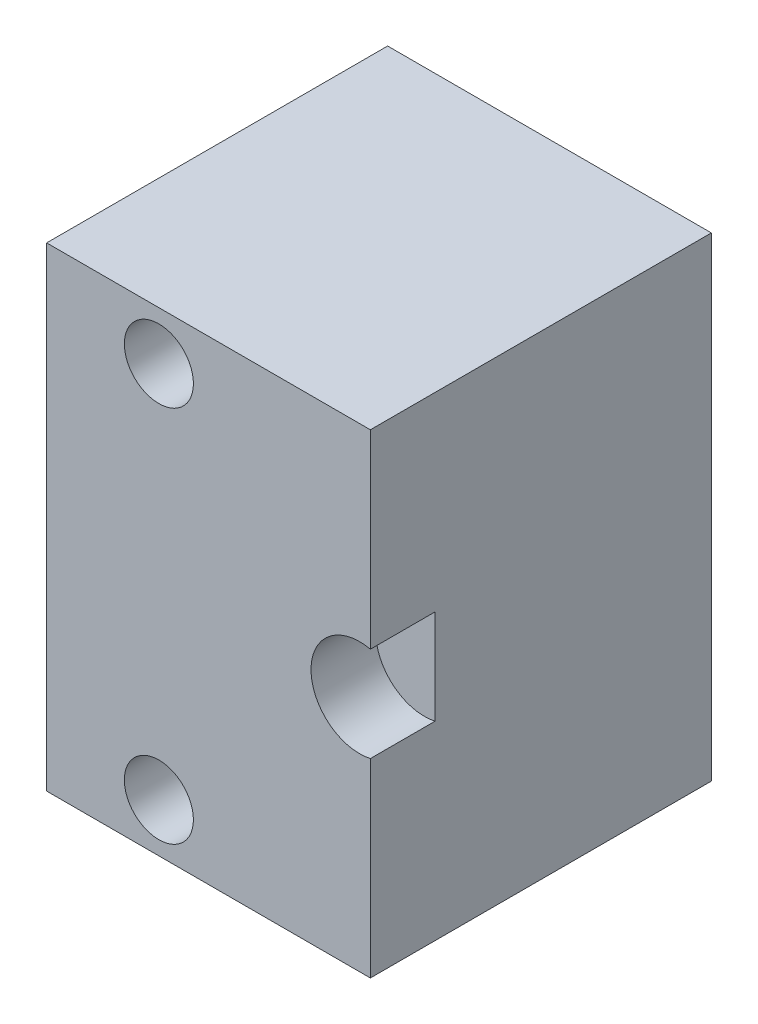
ISO-10303-21;
HEADER;
FILE_DESCRIPTION(('STEP AP214'),'2;1');
FILE_NAME('part.step','',(''),(''),'','','');
FILE_SCHEMA(('AUTOMOTIVE_DESIGN { 1 0 10303 214 1 1 1 1 }'));
ENDSEC;
DATA;
#1=APPLICATION_CONTEXT('core data for automotive mechanical design processes');
#2=APPLICATION_PROTOCOL_DEFINITION('international standard','automotive_design',2000,#1);
#3=PRODUCT_CONTEXT('',#1,'mechanical');
#4=PRODUCT('Part','Part','',(#3));
#5=PRODUCT_RELATED_PRODUCT_CATEGORY('part','',(#4));
#6=PRODUCT_DEFINITION_FORMATION('','',#4);
#7=PRODUCT_DEFINITION_CONTEXT('part definition',#1,'design');
#8=PRODUCT_DEFINITION('design','',#6,#7);
#9=PRODUCT_DEFINITION_SHAPE('','',#8);
#10=(LENGTH_UNIT() NAMED_UNIT(*) SI_UNIT(.MILLI.,.METRE.));
#11=(NAMED_UNIT(*) PLANE_ANGLE_UNIT() SI_UNIT($,.RADIAN.));
#12=(NAMED_UNIT(*) SI_UNIT($,.STERADIAN.) SOLID_ANGLE_UNIT());
#13=UNCERTAINTY_MEASURE_WITH_UNIT(LENGTH_MEASURE(1.E-05),#10,'distance_accuracy_value','');
#14=(GEOMETRIC_REPRESENTATION_CONTEXT(3) GLOBAL_UNCERTAINTY_ASSIGNED_CONTEXT((#13)) GLOBAL_UNIT_ASSIGNED_CONTEXT((#10,
#11,#12)) REPRESENTATION_CONTEXT('',''));
#15=CARTESIAN_POINT('',(0.,0.,0.));
#16=DIRECTION('',(0.,0.,1.));
#17=DIRECTION('',(1.,0.,0.));
#18=AXIS2_PLACEMENT_3D('',#15,#16,#17);
#19=CARTESIAN_POINT('',(0.,0.,15.8));
#20=DIRECTION('',(0.,0.,1.));
#21=DIRECTION('',(1.,0.,0.));
#22=AXIS2_PLACEMENT_3D('',#19,#20,#21);
#23=PLANE('',#22);
#24=CARTESIAN_POINT('',(14.5,11.,15.8));
#25=DIRECTION('',(0.,0.,1.));
#26=DIRECTION('',(1.,0.,0.));
#27=AXIS2_PLACEMENT_3D('',#24,#25,#26);
#28=CIRCLE('',#27,2.25);
#29=CARTESIAN_POINT('',(15.,13.193741096848,15.8));
#30=VERTEX_POINT('',#29);
#31=CARTESIAN_POINT('',(15.,8.80625890315197,15.8));
#32=VERTEX_POINT('',#31);
#33=EDGE_CURVE('E98',#30,#32,#28,.T.);
#34=ORIENTED_EDGE('',*,*,#33,.F.);
#35=DIRECTION('',(0.,1.,0.));
#36=VECTOR('',#35,1.);
#37=CARTESIAN_POINT('',(15.,22.,15.8));
#38=LINE('',#37,#36);
#39=CARTESIAN_POINT('',(15.,22.,15.8));
#40=VERTEX_POINT('',#39);
#41=EDGE_CURVE('E86',#30,#40,#38,.T.);
#42=ORIENTED_EDGE('',*,*,#41,.T.);
#43=DIRECTION('',(-1.,0.,0.));
#44=VECTOR('',#43,1.);
#45=CARTESIAN_POINT('',(0.,22.,15.8));
#46=LINE('',#45,#44);
#47=CARTESIAN_POINT('',(0.,22.,15.8));
#48=VERTEX_POINT('',#47);
#49=EDGE_CURVE('E111',#40,#48,#46,.T.);
#50=ORIENTED_EDGE('',*,*,#49,.T.);
#51=DIRECTION('',(0.,-1.,0.));
#52=VECTOR('',#51,1.);
#53=CARTESIAN_POINT('',(0.,22.,15.8));
#54=LINE('',#53,#52);
#55=CARTESIAN_POINT('',(0.,0.,15.8));
#56=VERTEX_POINT('',#55);
#57=EDGE_CURVE('E119',#48,#56,#54,.T.);
#58=ORIENTED_EDGE('',*,*,#57,.T.);
#59=DIRECTION('',(1.,0.,0.));
#60=VECTOR('',#59,1.);
#61=CARTESIAN_POINT('',(0.,0.,15.8));
#62=LINE('',#61,#60);
#63=CARTESIAN_POINT('',(15.,0.,15.8));
#64=VERTEX_POINT('',#63);
#65=EDGE_CURVE('E58',#56,#64,#62,.T.);
#66=ORIENTED_EDGE('',*,*,#65,.T.);
#67=EDGE_CURVE('E104',#64,#32,#38,.T.);
#68=ORIENTED_EDGE('',*,*,#67,.T.);
#69=EDGE_LOOP('',(#34,#42,#50,#58,#66,#68));
#70=FACE_BOUND('',#69,.T.);
#71=CARTESIAN_POINT('',(5.2,19.75,15.8));
#72=DIRECTION('',(0.,0.,1.));
#73=DIRECTION('',(1.,0.,0.));
#74=AXIS2_PLACEMENT_3D('',#71,#72,#73);
#75=CIRCLE('',#74,1.6);
#76=CARTESIAN_POINT('',(6.8,19.75,15.8));
#77=VERTEX_POINT('',#76);
#78=EDGE_CURVE('E126',#77,#77,#75,.T.);
#79=ORIENTED_EDGE('',*,*,#78,.F.);
#80=EDGE_LOOP('',(#79));
#81=FACE_BOUND('',#80,.T.);
#82=CARTESIAN_POINT('',(5.2,2.25,15.8));
#83=DIRECTION('',(0.,0.,1.));
#84=DIRECTION('',(1.,0.,0.));
#85=AXIS2_PLACEMENT_3D('',#82,#83,#84);
#86=CIRCLE('',#85,1.6);
#87=CARTESIAN_POINT('',(6.8,2.25,15.8));
#88=VERTEX_POINT('',#87);
#89=EDGE_CURVE('E235',#88,#88,#86,.T.);
#90=ORIENTED_EDGE('',*,*,#89,.F.);
#91=EDGE_LOOP('',(#90));
#92=FACE_BOUND('',#91,.T.);
#93=ADVANCED_FACE('F35',(#70,#81,#92),#23,.T.);
#94=CARTESIAN_POINT('',(0.,0.,0.));
#95=DIRECTION('',(0.,0.,1.));
#96=DIRECTION('',(1.,0.,0.));
#97=AXIS2_PLACEMENT_3D('',#94,#95,#96);
#98=PLANE('',#97);
#99=DIRECTION('',(0.,1.,0.));
#100=VECTOR('',#99,1.);
#101=CARTESIAN_POINT('',(15.,22.,0.));
#102=LINE('',#101,#100);
#103=CARTESIAN_POINT('',(15.,0.,0.));
#104=VERTEX_POINT('',#103);
#105=CARTESIAN_POINT('',(15.,22.,0.));
#106=VERTEX_POINT('',#105);
#107=EDGE_CURVE('E123',#104,#106,#102,.T.);
#108=ORIENTED_EDGE('',*,*,#107,.F.);
#109=DIRECTION('',(1.,0.,0.));
#110=VECTOR('',#109,1.);
#111=CARTESIAN_POINT('',(0.,0.,0.));
#112=LINE('',#111,#110);
#113=CARTESIAN_POINT('',(0.,0.,0.));
#114=VERTEX_POINT('',#113);
#115=EDGE_CURVE('E79',#114,#104,#112,.T.);
#116=ORIENTED_EDGE('',*,*,#115,.F.);
#117=DIRECTION('',(0.,-1.,0.));
#118=VECTOR('',#117,1.);
#119=CARTESIAN_POINT('',(0.,22.,0.));
#120=LINE('',#119,#118);
#121=CARTESIAN_POINT('',(0.,22.,0.));
#122=VERTEX_POINT('',#121);
#123=EDGE_CURVE('E112',#122,#114,#120,.T.);
#124=ORIENTED_EDGE('',*,*,#123,.F.);
#125=DIRECTION('',(-1.,0.,0.));
#126=VECTOR('',#125,1.);
#127=CARTESIAN_POINT('',(0.,22.,0.));
#128=LINE('',#127,#126);
#129=EDGE_CURVE('E125',#106,#122,#128,.T.);
#130=ORIENTED_EDGE('',*,*,#129,.F.);
#131=EDGE_LOOP('',(#108,#116,#124,#130));
#132=FACE_BOUND('',#131,.T.);
#133=CARTESIAN_POINT('',(5.2,19.75,0.));
#134=DIRECTION('',(0.,0.,1.));
#135=DIRECTION('',(1.,0.,0.));
#136=AXIS2_PLACEMENT_3D('',#133,#134,#135);
#137=CIRCLE('',#136,1.6);
#138=CARTESIAN_POINT('',(6.8,19.75,0.));
#139=VERTEX_POINT('',#138);
#140=EDGE_CURVE('E116',#139,#139,#137,.T.);
#141=ORIENTED_EDGE('',*,*,#140,.T.);
#142=EDGE_LOOP('',(#141));
#143=FACE_BOUND('',#142,.T.);
#144=CARTESIAN_POINT('',(5.2,2.25,0.));
#145=DIRECTION('',(0.,0.,1.));
#146=DIRECTION('',(1.,0.,0.));
#147=AXIS2_PLACEMENT_3D('',#144,#145,#146);
#148=CIRCLE('',#147,1.6);
#149=CARTESIAN_POINT('',(6.8,2.25,0.));
#150=VERTEX_POINT('',#149);
#151=EDGE_CURVE('E238',#150,#150,#148,.T.);
#152=ORIENTED_EDGE('',*,*,#151,.T.);
#153=EDGE_LOOP('',(#152));
#154=FACE_BOUND('',#153,.T.);
#155=ADVANCED_FACE('F139',(#132,#143,#154),#98,.F.);
#156=CARTESIAN_POINT('',(15.,22.,15.8));
#157=DIRECTION('',(-1.,0.,0.));
#158=DIRECTION('',(0.,0.,1.));
#159=AXIS2_PLACEMENT_3D('',#156,#157,#158);
#160=PLANE('',#159);
#161=DIRECTION('',(0.,1.,0.));
#162=VECTOR('',#161,1.);
#163=CARTESIAN_POINT('',(15.,22.,12.8));
#164=LINE('',#163,#162);
#165=CARTESIAN_POINT('',(15.,8.80625890315197,12.8));
#166=VERTEX_POINT('',#165);
#167=CARTESIAN_POINT('',(15.,13.193741096848,12.8));
#168=VERTEX_POINT('',#167);
#169=EDGE_CURVE('E101',#166,#168,#164,.T.);
#170=ORIENTED_EDGE('',*,*,#169,.F.);
#171=DIRECTION('',(0.,0.,1.));
#172=VECTOR('',#171,1.);
#173=CARTESIAN_POINT('',(15.,8.80625890315197,12.8));
#174=LINE('',#173,#172);
#175=EDGE_CURVE('E11',#166,#32,#174,.T.);
#176=ORIENTED_EDGE('',*,*,#175,.T.);
#177=ORIENTED_EDGE('',*,*,#67,.F.);
#178=DIRECTION('',(0.,0.,-1.));
#179=VECTOR('',#178,1.);
#180=CARTESIAN_POINT('',(15.,0.,15.8));
#181=LINE('',#180,#179);
#182=EDGE_CURVE('E122',#64,#104,#181,.T.);
#183=ORIENTED_EDGE('',*,*,#182,.T.);
#184=ORIENTED_EDGE('',*,*,#107,.T.);
#185=DIRECTION('',(0.,0.,-1.));
#186=VECTOR('',#185,1.);
#187=CARTESIAN_POINT('',(15.,22.,15.8));
#188=LINE('',#187,#186);
#189=EDGE_CURVE('E109',#40,#106,#188,.T.);
#190=ORIENTED_EDGE('',*,*,#189,.F.);
#191=ORIENTED_EDGE('',*,*,#41,.F.);
#192=DIRECTION('',(0.,0.,1.));
#193=VECTOR('',#192,1.);
#194=CARTESIAN_POINT('',(15.,13.193741096848,12.8));
#195=LINE('',#194,#193);
#196=EDGE_CURVE('E43',#30,#168,#195,.F.);
#197=ORIENTED_EDGE('',*,*,#196,.T.);
#198=EDGE_LOOP('',(#170,#176,#177,#183,#184,#190,#191,#197));
#199=FACE_BOUND('',#198,.T.);
#200=ADVANCED_FACE('F37',(#199),#160,.F.);
#201=CARTESIAN_POINT('',(0.,22.,15.8));
#202=DIRECTION('',(0.,-1.,0.));
#203=DIRECTION('',(0.,0.,-1.));
#204=AXIS2_PLACEMENT_3D('',#201,#202,#203);
#205=PLANE('',#204);
#206=ORIENTED_EDGE('',*,*,#129,.T.);
#207=DIRECTION('',(0.,0.,-1.));
#208=VECTOR('',#207,1.);
#209=CARTESIAN_POINT('',(0.,22.,15.8));
#210=LINE('',#209,#208);
#211=EDGE_CURVE('E132',#48,#122,#210,.T.);
#212=ORIENTED_EDGE('',*,*,#211,.F.);
#213=ORIENTED_EDGE('',*,*,#49,.F.);
#214=ORIENTED_EDGE('',*,*,#189,.T.);
#215=EDGE_LOOP('',(#206,#212,#213,#214));
#216=FACE_BOUND('',#215,.T.);
#217=ADVANCED_FACE('F144',(#216),#205,.F.);
#218=CARTESIAN_POINT('',(0.,22.,15.8));
#219=DIRECTION('',(1.,0.,0.));
#220=DIRECTION('',(0.,1.,0.));
#221=AXIS2_PLACEMENT_3D('',#218,#219,#220);
#222=PLANE('',#221);
#223=ORIENTED_EDGE('',*,*,#123,.T.);
#224=DIRECTION('',(0.,0.,-1.));
#225=VECTOR('',#224,1.);
#226=CARTESIAN_POINT('',(0.,0.,15.8));
#227=LINE('',#226,#225);
#228=EDGE_CURVE('E130',#56,#114,#227,.T.);
#229=ORIENTED_EDGE('',*,*,#228,.F.);
#230=ORIENTED_EDGE('',*,*,#57,.F.);
#231=ORIENTED_EDGE('',*,*,#211,.T.);
#232=EDGE_LOOP('',(#223,#229,#230,#231));
#233=FACE_BOUND('',#232,.T.);
#234=ADVANCED_FACE('F148',(#233),#222,.F.);
#235=CARTESIAN_POINT('',(0.,0.,15.8));
#236=DIRECTION('',(0.,1.,0.));
#237=DIRECTION('',(0.,0.,1.));
#238=AXIS2_PLACEMENT_3D('',#235,#236,#237);
#239=PLANE('',#238);
#240=ORIENTED_EDGE('',*,*,#115,.T.);
#241=ORIENTED_EDGE('',*,*,#182,.F.);
#242=ORIENTED_EDGE('',*,*,#65,.F.);
#243=ORIENTED_EDGE('',*,*,#228,.T.);
#244=EDGE_LOOP('',(#240,#241,#242,#243));
#245=FACE_BOUND('',#244,.T.);
#246=ADVANCED_FACE('F149',(#245),#239,.F.);
#247=CARTESIAN_POINT('',(5.2,19.75,15.8));
#248=DIRECTION('',(0.,0.,-1.));
#249=DIRECTION('',(-1.,0.,0.));
#250=AXIS2_PLACEMENT_3D('',#247,#248,#249);
#251=CYLINDRICAL_SURFACE('',#250,1.6);
#252=ORIENTED_EDGE('',*,*,#78,.T.);
#253=EDGE_LOOP('',(#252));
#254=FACE_BOUND('',#253,.T.);
#255=ORIENTED_EDGE('',*,*,#140,.F.);
#256=EDGE_LOOP('',(#255));
#257=FACE_BOUND('',#256,.T.);
#258=ADVANCED_FACE('F151',(#254,#257),#251,.F.);
#259=CARTESIAN_POINT('',(5.2,2.25,15.8));
#260=DIRECTION('',(0.,0.,-1.));
#261=DIRECTION('',(-1.,0.,0.));
#262=AXIS2_PLACEMENT_3D('',#259,#260,#261);
#263=CYLINDRICAL_SURFACE('',#262,1.6);
#264=ORIENTED_EDGE('',*,*,#89,.T.);
#265=EDGE_LOOP('',(#264));
#266=FACE_BOUND('',#265,.T.);
#267=ORIENTED_EDGE('',*,*,#151,.F.);
#268=EDGE_LOOP('',(#267));
#269=FACE_BOUND('',#268,.T.);
#270=ADVANCED_FACE('F157',(#266,#269),#263,.F.);
#271=CARTESIAN_POINT('',(14.5,11.,12.8));
#272=DIRECTION('',(0.,0.,1.));
#273=DIRECTION('',(1.,0.,0.));
#274=AXIS2_PLACEMENT_3D('',#271,#272,#273);
#275=CYLINDRICAL_SURFACE('',#274,2.25);
#276=CARTESIAN_POINT('',(14.5,11.,12.8));
#277=DIRECTION('',(0.,0.,1.));
#278=DIRECTION('',(1.,0.,0.));
#279=AXIS2_PLACEMENT_3D('',#276,#277,#278);
#280=CIRCLE('',#279,2.25);
#281=EDGE_CURVE('E49',#168,#166,#280,.T.);
#282=ORIENTED_EDGE('',*,*,#281,.F.);
#283=ORIENTED_EDGE('',*,*,#196,.F.);
#284=ORIENTED_EDGE('',*,*,#33,.T.);
#285=ORIENTED_EDGE('',*,*,#175,.F.);
#286=EDGE_LOOP('',(#282,#283,#284,#285));
#287=FACE_BOUND('',#286,.T.);
#288=ADVANCED_FACE('F97',(#287),#275,.F.);
#289=CARTESIAN_POINT('',(14.5,11.,12.8));
#290=DIRECTION('',(0.,0.,1.));
#291=DIRECTION('',(1.,0.,0.));
#292=AXIS2_PLACEMENT_3D('',#289,#290,#291);
#293=PLANE('',#292);
#294=ORIENTED_EDGE('',*,*,#169,.T.);
#295=ORIENTED_EDGE('',*,*,#281,.T.);
#296=EDGE_LOOP('',(#294,#295));
#297=FACE_BOUND('',#296,.T.);
#298=ADVANCED_FACE('F136',(#297),#293,.T.);
#299=CLOSED_SHELL('',(#93,#155,#200,#217,#234,#246,#258,#270,#288,#298));
#300=MANIFOLD_SOLID_BREP('B2',#299);
#301=ADVANCED_BREP_SHAPE_REPRESENTATION('',(#18,#300),#14);
#302=SHAPE_DEFINITION_REPRESENTATION(#9,#301);
ENDSEC;
END-ISO-10303-21;
